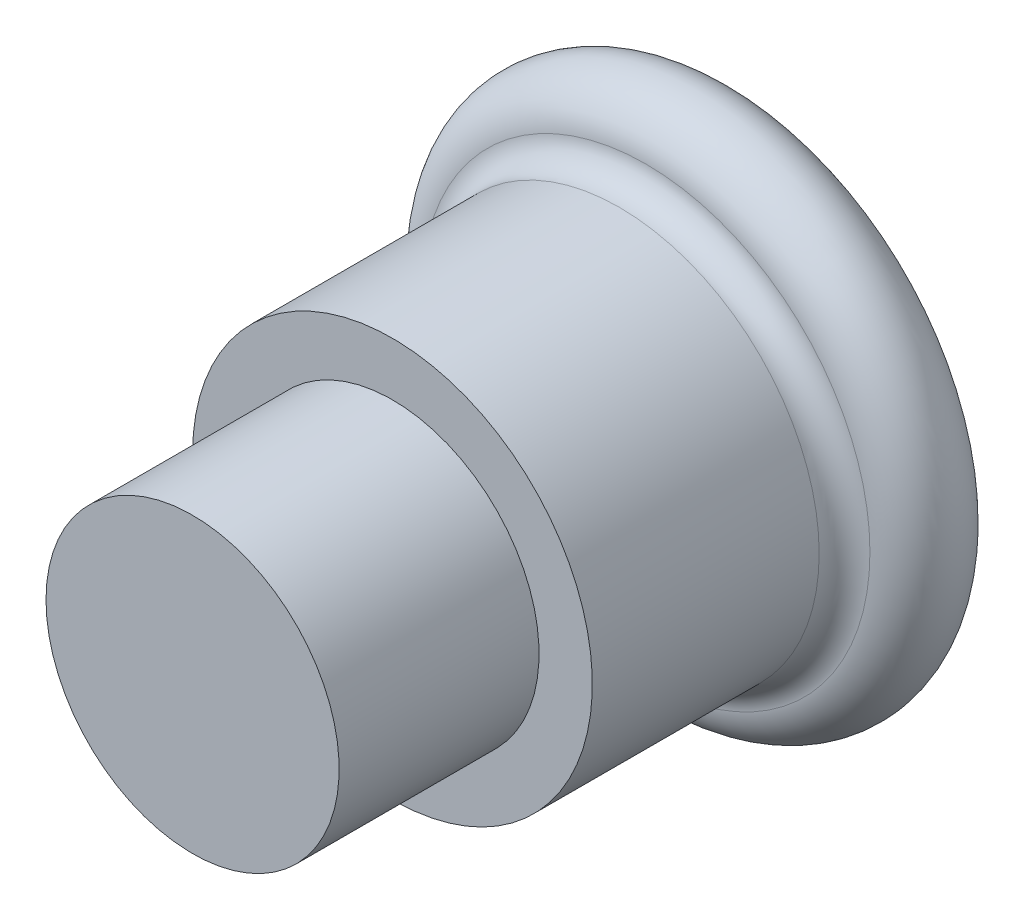
ISO-10303-21;
HEADER;
FILE_DESCRIPTION(('STEP AP214'),'2;1');
FILE_NAME('part.step','',(''),(''),'','','');
FILE_SCHEMA(('AUTOMOTIVE_DESIGN { 1 0 10303 214 1 1 1 1 }'));
ENDSEC;
DATA;
#1=APPLICATION_CONTEXT('core data for automotive mechanical design processes');
#2=APPLICATION_PROTOCOL_DEFINITION('international standard','automotive_design',2000,#1);
#3=PRODUCT_CONTEXT('',#1,'mechanical');
#4=PRODUCT('Part','Part','',(#3));
#5=PRODUCT_RELATED_PRODUCT_CATEGORY('part','',(#4));
#6=PRODUCT_DEFINITION_FORMATION('','',#4);
#7=PRODUCT_DEFINITION_CONTEXT('part definition',#1,'design');
#8=PRODUCT_DEFINITION('design','',#6,#7);
#9=PRODUCT_DEFINITION_SHAPE('','',#8);
#10=(LENGTH_UNIT() NAMED_UNIT(*) SI_UNIT(.MILLI.,.METRE.));
#11=(NAMED_UNIT(*) PLANE_ANGLE_UNIT() SI_UNIT($,.RADIAN.));
#12=(NAMED_UNIT(*) SI_UNIT($,.STERADIAN.) SOLID_ANGLE_UNIT());
#13=UNCERTAINTY_MEASURE_WITH_UNIT(LENGTH_MEASURE(1.E-05),#10,'distance_accuracy_value','');
#14=(GEOMETRIC_REPRESENTATION_CONTEXT(3) GLOBAL_UNCERTAINTY_ASSIGNED_CONTEXT((#13)) GLOBAL_UNIT_ASSIGNED_CONTEXT((#10,
#11,#12)) REPRESENTATION_CONTEXT('',''));
#15=CARTESIAN_POINT('',(0.,0.,0.));
#16=DIRECTION('',(0.,0.,1.));
#17=DIRECTION('',(1.,0.,0.));
#18=AXIS2_PLACEMENT_3D('',#15,#16,#17);
#19=CARTESIAN_POINT('',(40.0284395973154,22.0971476510067,41.));
#20=DIRECTION('',(0.,0.,1.));
#21=DIRECTION('',(1.,0.,0.));
#22=AXIS2_PLACEMENT_3D('',#19,#20,#21);
#23=PLANE('',#22);
#24=CARTESIAN_POINT('',(40.0284395973154,22.0971476510067,41.));
#25=DIRECTION('',(0.,0.,-1.));
#26=DIRECTION('',(-1.,0.,0.));
#27=AXIS2_PLACEMENT_3D('',#24,#25,#26);
#28=CIRCLE('',#27,11.);
#29=CARTESIAN_POINT('',(29.0284395973155,22.0971476510067,41.));
#30=VERTEX_POINT('',#29);
#31=EDGE_CURVE('E21',#30,#30,#28,.T.);
#32=ORIENTED_EDGE('',*,*,#31,.F.);
#33=EDGE_LOOP('',(#32));
#34=FACE_BOUND('',#33,.T.);
#35=ADVANCED_FACE('F17',(#34),#23,.T.);
#36=CARTESIAN_POINT('',(40.0284395973154,22.0971476510067,41.));
#37=DIRECTION('',(0.,0.,-1.));
#38=DIRECTION('',(-1.,0.,0.));
#39=AXIS2_PLACEMENT_3D('',#36,#37,#38);
#40=CYLINDRICAL_SURFACE('',#39,11.);
#41=ORIENTED_EDGE('',*,*,#31,.T.);
#42=EDGE_LOOP('',(#41));
#43=FACE_BOUND('',#42,.T.);
#44=CARTESIAN_POINT('',(40.0284395973154,22.0971476510067,26.));
#45=DIRECTION('',(0.,0.,-1.));
#46=DIRECTION('',(-1.,0.,0.));
#47=AXIS2_PLACEMENT_3D('',#44,#45,#46);
#48=CIRCLE('',#47,11.);
#49=CARTESIAN_POINT('',(29.0284395973155,22.0971476510067,26.));
#50=VERTEX_POINT('',#49);
#51=EDGE_CURVE('E85',#50,#50,#48,.T.);
#52=ORIENTED_EDGE('',*,*,#51,.F.);
#53=EDGE_LOOP('',(#52));
#54=FACE_BOUND('',#53,.T.);
#55=ADVANCED_FACE('F68',(#43,#54),#40,.T.);
#56=CARTESIAN_POINT('',(40.0284395973154,22.0971476510067,26.));
#57=DIRECTION('',(0.,0.,1.));
#58=DIRECTION('',(1.,0.,0.));
#59=AXIS2_PLACEMENT_3D('',#56,#57,#58);
#60=PLANE('',#59);
#61=CARTESIAN_POINT('',(40.0284395973154,22.0971476510067,26.));
#62=DIRECTION('',(0.,0.,-1.));
#63=DIRECTION('',(-1.,0.,0.));
#64=AXIS2_PLACEMENT_3D('',#61,#62,#63);
#65=CIRCLE('',#64,15.);
#66=CARTESIAN_POINT('',(25.0284395973154,22.0971476510067,26.));
#67=VERTEX_POINT('',#66);
#68=EDGE_CURVE('E55',#67,#67,#65,.T.);
#69=ORIENTED_EDGE('',*,*,#68,.F.);
#70=EDGE_LOOP('',(#69));
#71=FACE_BOUND('',#70,.T.);
#72=ORIENTED_EDGE('',*,*,#51,.T.);
#73=EDGE_LOOP('',(#72));
#74=FACE_BOUND('',#73,.T.);
#75=ADVANCED_FACE('F72',(#71,#74),#60,.T.);
#76=CARTESIAN_POINT('',(40.0284395973154,22.0971476510067,26.));
#77=DIRECTION('',(0.,0.,-1.));
#78=DIRECTION('',(-1.,0.,0.));
#79=AXIS2_PLACEMENT_3D('',#76,#77,#78);
#80=CYLINDRICAL_SURFACE('',#79,15.);
#81=CARTESIAN_POINT('',(40.0284395973154,22.0971476510067,8.97722557505166));
#82=DIRECTION('',(0.,0.,1.));
#83=DIRECTION('',(1.,0.,0.));
#84=AXIS2_PLACEMENT_3D('',#81,#82,#83);
#85=CIRCLE('',#84,15.);
#86=CARTESIAN_POINT('',(55.0284395973154,22.0971476510067,8.97722557505166));
#87=VERTEX_POINT('',#86);
#88=EDGE_CURVE('E52',#87,#87,#85,.T.);
#89=ORIENTED_EDGE('',*,*,#88,.T.);
#90=EDGE_LOOP('',(#89));
#91=FACE_BOUND('',#90,.T.);
#92=ORIENTED_EDGE('',*,*,#68,.T.);
#93=EDGE_LOOP('',(#92));
#94=FACE_BOUND('',#93,.T.);
#95=ADVANCED_FACE('F46',(#91,#94),#80,.T.);
#96=CARTESIAN_POINT('',(40.0284395973154,22.0971476510067,8.97722557505166));
#97=DIRECTION('',(0.,0.,1.));
#98=DIRECTION('',(1.,0.,0.));
#99=AXIS2_PLACEMENT_3D('',#96,#97,#98);
#100=TOROIDAL_SURFACE('',#99,17.,2.);
#101=ORIENTED_EDGE('',*,*,#88,.F.);
#102=EDGE_LOOP('',(#101));
#103=FACE_BOUND('',#102,.T.);
#104=CARTESIAN_POINT('',(40.0284395973154,22.0971476510067,6.9855071841238));
#105=DIRECTION('',(0.,0.,-1.));
#106=DIRECTION('',(1.,0.,0.));
#107=AXIS2_PLACEMENT_3D('',#104,#105,#106);
#108=CIRCLE('',#107,16.8181818181819);
#109=CARTESIAN_POINT('',(56.8466214154973,22.0971476510067,6.9855071841238));
#110=VERTEX_POINT('',#109);
#111=EDGE_CURVE('E35',#110,#110,#108,.T.);
#112=ORIENTED_EDGE('',*,*,#111,.F.);
#113=EDGE_LOOP('',(#112));
#114=FACE_BOUND('',#113,.T.);
#115=ADVANCED_FACE('F38',(#103,#114),#100,.F.);
#116=CARTESIAN_POINT('',(40.0284395973154,22.0971476510067,3.50000000000004));
#117=DIRECTION('',(0.,0.,1.));
#118=DIRECTION('',(0.,-1.,0.));
#119=AXIS2_PLACEMENT_3D('',#116,#117,#118);
#120=TOROIDAL_SURFACE('',#119,16.5,3.50000000000002);
#121=ORIENTED_EDGE('',*,*,#111,.T.);
#122=EDGE_LOOP('',(#121));
#123=FACE_BOUND('',#122,.T.);
#124=CARTESIAN_POINT('',(40.0284395973154,22.0971476510067,0.));
#125=DIRECTION('',(0.,0.,1.));
#126=DIRECTION('',(0.,-1.,0.));
#127=AXIS2_PLACEMENT_3D('',#124,#125,#126);
#128=CIRCLE('',#127,16.5);
#129=CARTESIAN_POINT('',(56.5284395973154,22.0971476510067,0.));
#130=VERTEX_POINT('',#129);
#131=CARTESIAN_POINT('',(23.5284395973154,22.0971476510067,0.));
#132=VERTEX_POINT('',#131);
#133=EDGE_CURVE('E11',#130,#132,#128,.T.);
#134=ORIENTED_EDGE('',*,*,#133,.T.);
#135=CARTESIAN_POINT('',(23.5284395973154,22.0971476510067,0.));
#136=CARTESIAN_POINT('',(23.528437015446,21.8759440441793,0.));
#137=CARTESIAN_POINT('',(23.5328877770688,21.6547406173046,0.));
#138=CARTESIAN_POINT('',(23.5506774516239,21.2126914273743,0.));
#139=CARTESIAN_POINT('',(23.5640163645561,20.9918456643186,0.));
#140=CARTESIAN_POINT('',(23.5995638060545,20.5508691059397,0.));
#141=CARTESIAN_POINT('',(23.6217723346208,20.3307383106164,0.));
#142=CARTESIAN_POINT('',(23.6750222747658,19.8915476802751,0.));
#143=CARTESIAN_POINT('',(23.7060636863446,19.6724878452572,0.));
#144=CARTESIAN_POINT('',(23.7769294062489,19.2357934375263,0.));
#145=CARTESIAN_POINT('',(23.8167537145743,19.0181588648134,0.));
#146=CARTESIAN_POINT('',(23.9051207602591,18.5846669674482,0.));
#147=CARTESIAN_POINT('',(23.9536634976185,18.3688096427958,0.));
#148=CARTESIAN_POINT('',(24.0593889071723,17.9392213558399,0.));
#149=CARTESIAN_POINT('',(24.1165715793668,17.7254903935362,0.));
#150=CARTESIAN_POINT('',(24.239484370726,17.300500505887,0.));
#151=CARTESIAN_POINT('',(24.3052144898909,17.0892415805416,0.));
#152=CARTESIAN_POINT('',(24.4451158690731,16.6695374429162,0.));
#153=CARTESIAN_POINT('',(24.5192871290904,16.4610922306363,0.));
#154=CARTESIAN_POINT('',(24.6759508283559,16.0473526467265,0.));
#155=CARTESIAN_POINT('',(24.7584432676039,15.8420582750967,0.));
#156=CARTESIAN_POINT('',(24.9316159131283,15.4349523957149,0.));
#157=CARTESIAN_POINT('',(25.0222961194046,15.2331408879628,0.));
#158=CARTESIAN_POINT('',(25.2116976175371,14.8333271579736,0.));
#159=CARTESIAN_POINT('',(25.3104189093933,14.6353249357365,0.));
#160=CARTESIAN_POINT('',(25.5157429920697,14.2434499204384,0.));
#161=CARTESIAN_POINT('',(25.62234578289,14.0495771273774,0.));
#162=CARTESIAN_POINT('',(25.8432601568723,13.666274872387,0.));
#163=CARTESIAN_POINT('',(25.9575717400343,13.4768454104576,0.));
#164=CARTESIAN_POINT('',(26.1937199163272,13.1027349025478,0.));
#165=CARTESIAN_POINT('',(26.315556509458,12.9180538565673,0.));
#166=CARTESIAN_POINT('',(26.5665535580216,12.5537436717508,0.));
#167=CARTESIAN_POINT('',(26.6957140134543,12.3741145329148,0.));
#168=CARTESIAN_POINT('',(27.0088359025912,11.9566200095101,0.));
#169=CARTESIAN_POINT('',(27.195818199387,11.7210104521455,0.));
#170=CARTESIAN_POINT('',(27.5823716913361,11.2603673919487,0.));
#171=CARTESIAN_POINT('',(27.7819428864894,11.0353338891164,0.));
#172=CARTESIAN_POINT('',(28.1930844216134,10.5965056574762,0.));
#173=CARTESIAN_POINT('',(28.4046547615841,10.3827109286681,0.));
#174=CARTESIAN_POINT('',(28.8391608191685,9.96700158082949,0.));
#175=CARTESIAN_POINT('',(29.0620965367823,9.7650869617989,2.13059551641059E-13));
#176=CARTESIAN_POINT('',(29.5186673338017,9.37374046215976,-2.10457466427094E-13));
#177=CARTESIAN_POINT('',(29.7523024132073,9.18430858155121,-7.8899543954622E-13));
#178=CARTESIAN_POINT('',(30.229575280354,8.81849354553891,7.91597524760196E-13));
#179=CARTESIAN_POINT('',(30.4732130680951,8.64211039013515,2.95072846218578E-12));
#180=CARTESIAN_POINT('',(30.9697577861771,8.30292040259792,-2.94812637697182E-12));
#181=CARTESIAN_POINT('',(31.2226647165181,8.14011357046444,-1.1006112153555E-11));
#182=CARTESIAN_POINT('',(31.7370132367667,7.82856022000536,1.10087142387688E-11));
#183=CARTESIAN_POINT('',(31.9984548266744,7.67981370167974,4.10815264076752E-11));
#184=CARTESIAN_POINT('',(32.4100625815871,7.46027791887369,-2.26587110569135E-11));
#185=CARTESIAN_POINT('',(32.5575590109067,7.38443976189951,-6.69682338323211E-11));
#186=CARTESIAN_POINT('',(32.8547661665966,7.23722204861299,2.81139414913089E-10));
#187=CARTESIAN_POINT('',(33.0044768991489,7.16584250475108,6.73557805914682E-10));
#188=CARTESIAN_POINT('',(33.3059759788164,7.02761581742051,2.75314151790102E-09));
#189=CARTESIAN_POINT('',(33.4577643386474,6.96076870170653,4.44031476663758E-09));
#190=CARTESIAN_POINT('',(33.763278695079,6.83165435332084,1.29073468585511E-08));
#191=CARTESIAN_POINT('',(33.917004709984,6.76938716395181,1.96872538461597E-08));
#192=CARTESIAN_POINT('',(34.2263126347995,6.64951423988632,3.51419025486147E-08));
#193=CARTESIAN_POINT('',(34.381895040044,6.59190978275688,4.38171611886819E-08));
#194=CARTESIAN_POINT('',(34.6947491105035,6.48148677021871,5.06452580959315E-08));
#195=CARTESIAN_POINT('',(34.8520207785378,6.42866822279905,4.87980787984325E-08));
#196=CARTESIAN_POINT('',(35.1680916592391,6.32782178902913,3.68873393009828E-08));
#197=CARTESIAN_POINT('',(35.3268908594018,6.27979386349944,2.68238463031707E-08));
#198=CARTESIAN_POINT('',(35.6459045229673,6.18870106448228,9.3795579334001E-09));
#199=CARTESIAN_POINT('',(35.806118960805,6.14563610153944,1.99871420262402E-09));
#200=CARTESIAN_POINT('',(36.0600107204934,6.08121475323975,-1.15746113697959E-09));
#201=CARTESIAN_POINT('',(36.1533107022892,6.05835042230301,-5.09965032646705E-10));
#202=CARTESIAN_POINT('',(36.4867335589216,5.97972380125605,2.35237929208365E-09));
#203=CARTESIAN_POINT('',(36.7279556821678,5.9285202797829,5.4337446004918E-09));
#204=CARTESIAN_POINT('',(37.1506081968962,5.84865860284372,1.70729568297019E-08));
#205=CARTESIAN_POINT('',(37.331588684745,5.81758152844715,2.40326734185535E-08));
#206=CARTESIAN_POINT('',(37.6688812047637,5.76548595873597,3.26364489978127E-08));
#207=CARTESIAN_POINT('',(37.8250694474557,5.74366685310357,3.48921535686173E-08));
#208=CARTESIAN_POINT('',(38.1512343634247,5.70288807931044,3.527806834714E-08));
#209=CARTESIAN_POINT('',(38.3212608379936,5.68432587836788,3.30435329608578E-08));
#210=CARTESIAN_POINT('',(38.6618088694126,5.6525167360497,2.69783764131715E-08));
#211=CARTESIAN_POINT('',(38.8323304239844,5.63926977025203,2.31477625854784E-08));
#212=CARTESIAN_POINT('',(39.173701743835,5.61808592465164,1.45754959185342E-08));
#213=CARTESIAN_POINT('',(39.3445515064491,5.61014900191741,9.83385044534318E-09));
#214=CARTESIAN_POINT('',(39.6864168265802,5.59967565414403,2.83597194686178E-09));
#215=CARTESIAN_POINT('',(39.8574323821552,5.59713916659294,5.79710152525367E-10));
#216=CARTESIAN_POINT('',(40.136096652979,5.59715299234278,-3.64952587214559E-10));
#217=CARTESIAN_POINT('',(40.2437504030922,5.59816698051228,-6.54395028529931E-11));
#218=CARTESIAN_POINT('',(40.6350468915634,5.60569075132392,2.84973744080141E-09));
#219=CARTESIAN_POINT('',(40.9186095277088,5.61847602723685,8.45194109247584E-09));
#220=CARTESIAN_POINT('',(41.3550916099908,5.6494590625141,2.12119693929448E-08));
#221=CARTESIAN_POINT('',(41.5084047060874,5.66250136187083,2.64842674484614E-08));
#222=CARTESIAN_POINT('',(41.8055068659079,5.69199680497918,3.34419541062494E-08));
#223=CARTESIAN_POINT('',(41.9493201976663,5.70820103253489,3.53219780604257E-08));
#224=CARTESIAN_POINT('',(42.1835599903279,5.73774610437096,3.44819645216452E-08));
#225=CARTESIAN_POINT('',(42.274133497689,5.74994216642878,3.32015907202628E-08));
#226=CARTESIAN_POINT('',(42.6048492513086,5.79728221729678,2.78658145014361E-08));
#227=CARTESIAN_POINT('',(42.8443507339435,5.83698881348105,2.27256304235366E-08));
#228=CARTESIAN_POINT('',(43.4167816882326,5.94491191514615,1.2927720962638E-08));
#229=CARTESIAN_POINT('',(43.7487739267392,6.01817972005836,9.2848557739191E-09));
#230=CARTESIAN_POINT('',(44.2663703120598,6.14931454025894,4.21041127247206E-09));
#231=CARTESIAN_POINT('',(44.4537419165506,6.20032724201495,2.50018380636407E-09));
#232=CARTESIAN_POINT('',(44.7764938503378,6.29431537550194,1.52798099646021E-09));
#233=CARTESIAN_POINT('',(44.9123176389845,6.33576794728412,1.73168767542466E-09));
#234=CARTESIAN_POINT('',(45.186079780279,6.42316392145551,1.54217920505154E-09));
#235=CARTESIAN_POINT('',(45.3239914813162,6.46919074963195,1.1346360453687E-09));
#236=CARTESIAN_POINT('',(45.5985826498362,6.5647950475108,1.19191266774812E-08));
#237=CARTESIAN_POINT('',(45.735262106653,6.61437254791358,2.31112607754465E-08));
#238=CARTESIAN_POINT('',(46.0000075001673,6.71452251845726,3.14944714855824E-08));
#239=CARTESIAN_POINT('',(46.1281462424221,6.76490322789594,2.9395681630913E-08));
#240=CARTESIAN_POINT('',(46.5286871132103,6.92824030625381,1.98435617824791E-08));
#241=CARTESIAN_POINT('',(46.7987660821442,7.04696822228728,9.01267202368843E-09));
#242=CARTESIAN_POINT('',(47.2656036266585,7.26723643282075,7.82560213975234E-10));
#243=CARTESIAN_POINT('',(47.4638392006459,7.36567148883035,7.05846033808467E-10));
#244=CARTESIAN_POINT('',(47.8282665860726,7.55579705582975,7.56854760548307E-10));
#245=CARTESIAN_POINT('',(47.9949997843531,7.64645031595624,8.5700742990564E-10));
#246=CARTESIAN_POINT('',(48.3502359027357,7.84758053458412,2.7890264652529E-09));
#247=CARTESIAN_POINT('',(48.538217053823,7.95898195087309,4.88053269739174E-09));
#248=CARTESIAN_POINT('',(48.836406640233,8.14379010551388,1.03842617518527E-08));
#249=CARTESIAN_POINT('',(48.9480665419156,8.21486648468174,1.29510426541422E-08));
#250=CARTESIAN_POINT('',(49.1696360282619,8.35969518441631,1.74058128884579E-08));
#251=CARTESIAN_POINT('',(49.2795456057212,8.43344751599332,1.92937994272112E-08));
#252=CARTESIAN_POINT('',(49.6428812386447,8.68367011936923,2.38932301463568E-08));
#253=CARTESIAN_POINT('',(49.8923045974473,8.86600550636316,2.43472335845848E-08));
#254=CARTESIAN_POINT('',(50.3804871623596,9.24441952183137,1.89896156176532E-08));
#255=CARTESIAN_POINT('',(50.6192464181413,9.44049808628078,1.31780233999969E-08));
#256=CARTESIAN_POINT('',(50.9854394508946,9.75894130478758,4.6852690262936E-09));
#257=CARTESIAN_POINT('',(51.1167346006018,9.87688744492164,1.729846111884E-09));
#258=CARTESIAN_POINT('',(51.2794575507575,10.0278247368079,4.30437967023318E-10));
#259=CARTESIAN_POINT('',(51.3126775750354,10.058893809427,2.91861075861792E-10));
#260=CARTESIAN_POINT('',(51.4860998175863,10.2224228169744,-2.49385300538101E-10));
#261=CARTESIAN_POINT('',(51.6241445282661,10.3571929590654,-5.27014929477956E-11));
#262=CARTESIAN_POINT('',(51.8596228090846,10.5952929093649,8.96325890199116E-11));
#263=CARTESIAN_POINT('',(51.9581612832232,10.6975358435961,8.78260678530474E-11));
#264=CARTESIAN_POINT('',(52.1733581215969,10.92666283279,9.40617758058154E-11));
#265=CARTESIAN_POINT('',(52.2893855106597,11.0541409776032,1.04292585414258E-10));
#266=CARTESIAN_POINT('',(52.5374734793709,11.3354403980585,9.44554944508047E-11));
#267=CARTESIAN_POINT('',(52.6687579691595,11.4899464125001,6.87328307959103E-11));
#268=CARTESIAN_POINT('',(52.9447791170415,11.827188665651,2.08211968459351E-11));
#269=CARTESIAN_POINT('',(53.0885857710608,12.0106872920077,-2.6159529172995E-13));
#270=CARTESIAN_POINT('',(53.3611677431591,12.3741076841074,2.50802568164835E-13));
#271=CARTESIAN_POINT('',(53.4903356000968,12.5537353325195,1.9726241164997E-11));
#272=CARTESIAN_POINT('',(53.7413442899661,12.9180407362892,8.43485286552664E-11));
#273=CARTESIAN_POINT('',(53.8631851149883,13.1027184970981,1.29495405260312E-10));
#274=CARTESIAN_POINT('',(54.0993419796802,13.4768239560639,2.33140779086578E-10));
#275=CARTESIAN_POINT('',(54.2136580123874,13.6662516586156,2.91639288661518E-10));
#276=CARTESIAN_POINT('',(54.4345805075572,14.0495509317201,4.1189087380702E-10));
#277=CARTESIAN_POINT('',(54.5411869640753,14.2434225056991,4.73643951886985E-10));
#278=CARTESIAN_POINT('',(54.7465177819256,14.6352957823145,5.92057431248348E-10));
#279=CARTESIAN_POINT('',(54.8452421383958,14.8332974874984,6.4871782938835E-10));
#280=CARTESIAN_POINT('',(55.034649042533,15.2331107319921,7.5047632276504E-10));
#281=CARTESIAN_POINT('',(55.1253315864796,15.4349222730645,7.95574412652644E-10));
#282=CARTESIAN_POINT('',(55.2985081488256,15.8420286953163,8.69581459179693E-10));
#283=CARTESIAN_POINT('',(55.3810021646996,16.0473235775701,8.98490410826079E-10));
#284=CARTESIAN_POINT('',(55.5376682081606,16.4610645606545,9.37344028029058E-10));
#285=CARTESIAN_POINT('',(55.6118402344643,16.6695106619709,9.47288690661168E-10));
#286=CARTESIAN_POINT('',(55.7517423003374,17.0892168599856,9.47288686265164E-10));
#287=CARTESIAN_POINT('',(55.8174723399068,17.3004769566838,9.3734401923705E-10));
#288=CARTESIAN_POINT('',(55.9403840955808,17.7254693694232,8.98490419618086E-10));
#289=CARTESIAN_POINT('',(55.9975658130036,17.9392016850832,8.69581489951715E-10));
#290=CARTESIAN_POINT('',(56.1032884143463,18.3687927594318,7.95574381880631E-10));
#291=CARTESIAN_POINT('',(56.1518293009313,18.5846515174646,7.50476208469008E-10));
#292=CARTESIAN_POINT('',(56.2401917322517,19.0181462587884,6.48717943684328E-10));
#293=CARTESIAN_POINT('',(56.2800132810209,19.2357822412573,5.92057857660172E-10));
#294=CARTESIAN_POINT('',(56.3508725631058,19.672479341134,4.73643525475424E-10));
#295=CARTESIAN_POINT('',(56.3819103018396,19.8915404576626,4.11889282457137E-10));
#296=CARTESIAN_POINT('',(56.4351519800488,20.3307334185047,2.91640880010173E-10));
#297=CARTESIAN_POINT('',(56.4573559263354,20.5508652619925,2.33146718067842E-10));
#298=CARTESIAN_POINT('',(56.4928932976366,20.9918435790797,1.29489466284544E-10));
#299=CARTESIAN_POINT('',(56.5062267308586,21.2126900520177,8.43263641088934E-11));
#300=CARTESIAN_POINT('',(56.5240045600399,21.6547402193,1.97484056874436E-11));
#301=CARTESIAN_POINT('',(56.5284489655946,21.8759439132583,3.33521647154167E-13));
#302=CARTESIAN_POINT('',(56.5284395973154,22.0971476510067,0.));
#303=B_SPLINE_CURVE_WITH_KNOTS('',3,(#135,#136,#137,#138,#139,#140,#141,#142,#143,#144,#145,
#146,#147,#148,#149,#150,#151,#152,#153,#154,#155,#156,#157,#158,#159,#160,#161,#162,#163,#164,
#165,#166,#167,#168,#169,#170,#171,#172,#173,#174,#175,#176,#177,#178,#179,#180,#181,#182,#183,
#184,#185,#186,#187,#188,#189,#190,#191,#192,#193,#194,#195,#196,#197,#198,#199,#200,#201,#202,
#203,#204,#205,#206,#207,#208,#209,#210,#211,#212,#213,#214,#215,#216,#217,#218,#219,#220,#221,
#222,#223,#224,#225,#226,#227,#228,#229,#230,#231,#232,#233,#234,#235,#236,#237,#238,#239,#240,
#241,#242,#243,#244,#245,#246,#247,#248,#249,#250,#251,#252,#253,#254,#255,#256,#257,#258,#259,
#260,#261,#262,#263,#264,#265,#266,#267,#268,#269,#270,#271,#272,#273,#274,#275,#276,#277,#278,
#279,#280,#281,#282,#283,#284,#285,#286,#287,#288,#289,#290,#291,#292,#293,#294,#295,#296,#297,
#298,#299,#300,#301,#302),.UNSPECIFIED.,.F.,.F.,(4,2,2,2,2,2,2,2,2,2,2,2,2,2,2,2,2,2,2,2,2,2,2,
2,2,2,2,2,2,2,2,2,2,2,2,2,2,2,2,2,2,2,2,2,2,2,2,2,2,2,2,2,2,2,2,2,2,2,2,2,2,2,2,2,2,2,2,2,2,2,2,
2,2,2,2,2,2,2,2,2,2,2,2,4),(0.,0.663565793286258,1.32713158657251,1.99069737985876,
2.65426317314503,3.31782896643125,3.98139475971751,4.64496055300377,5.30852634629003,
5.97209213957628,6.63565793286254,7.2992237261488,7.96278951943502,8.62635531272128,
9.28992110600754,9.95348689929379,10.6170526925801,11.51894977929,12.420846866,13.3227439527099,
14.2246410394199,15.1265381261299,16.0284352128398,16.9303322995498,17.8322293862597,
18.3297193273628,18.8272106576168,19.324705034022,19.8222041135763,20.3198390473773,
20.8174748118604,21.3151065061664,21.8127292294621,22.1009044896835,22.8404030971827,
23.3911971837666,23.864246489677,24.377272138422,24.8902954299266,25.4033145736046,
25.9163277788729,26.2392936323545,27.0903809341594,27.551936121644,27.9860475680586,
28.260211400168,28.98828772068,30.0075069692242,30.5899760296411,31.0159544981171,
31.4520753854347,31.8882000440624,32.3012265607942,33.1858124747151,33.8496372650985,
34.4188825482615,35.0742292981498,35.4712805831777,35.868333502073,36.7946925987061,
37.7210473800285,38.2504346051619,38.3868885370059,38.9655153114188,39.3914694133665,
39.9085061697091,40.5166219292341,41.2158125062062,41.879378683537,42.5429455771706,
43.2065130847778,43.8700811040299,44.5336495325978,45.1972182681526,45.8607872083653,
46.524356250907,47.1879252934487,47.8514942336614,48.5150629692162,49.1786313977842,
49.8421994170362,50.5057669246435,51.169333818277,51.8328999956078),.UNSPECIFIED.);
#304=EDGE_CURVE('E26',#132,#130,#303,.T.);
#305=ORIENTED_EDGE('',*,*,#304,.T.);
#306=EDGE_LOOP('',(#134,#305));
#307=FACE_BOUND('',#306,.T.);
#308=ADVANCED_FACE('F19',(#123,#307),#120,.T.);
#309=CARTESIAN_POINT('',(40.0284395973154,22.0971476510067,0.));
#310=DIRECTION('',(0.,0.,1.));
#311=DIRECTION('',(1.,0.,0.));
#312=AXIS2_PLACEMENT_3D('',#309,#310,#311);
#313=PLANE('',#312);
#314=ORIENTED_EDGE('',*,*,#304,.F.);
#315=ORIENTED_EDGE('',*,*,#133,.F.);
#316=EDGE_LOOP('',(#314,#315));
#317=FACE_BOUND('',#316,.T.);
#318=ADVANCED_FACE('F33',(#317),#313,.F.);
#319=CLOSED_SHELL('',(#35,#55,#75,#95,#115,#308,#318));
#320=MANIFOLD_SOLID_BREP('B1',#319);
#321=ADVANCED_BREP_SHAPE_REPRESENTATION('',(#18,#320),#14);
#322=SHAPE_DEFINITION_REPRESENTATION(#9,#321);
ENDSEC;
END-ISO-10303-21;
